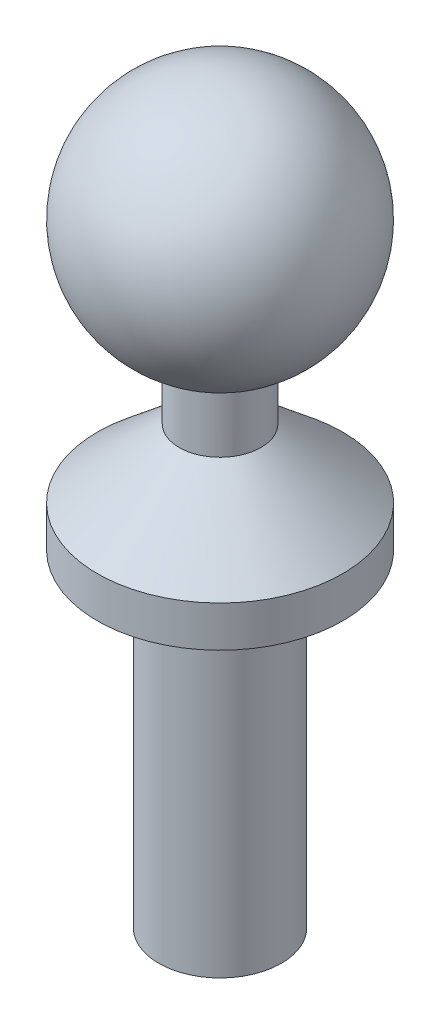
ISO-10303-21;
HEADER;
FILE_DESCRIPTION(('STEP AP214'),'2;1');
FILE_NAME('part.step','',(''),(''),'','','');
FILE_SCHEMA(('AUTOMOTIVE_DESIGN { 1 0 10303 214 1 1 1 1 }'));
ENDSEC;
DATA;
#1=APPLICATION_CONTEXT('core data for automotive mechanical design processes');
#2=APPLICATION_PROTOCOL_DEFINITION('international standard','automotive_design',2000,#1);
#3=PRODUCT_CONTEXT('',#1,'mechanical');
#4=PRODUCT('Part','Part','',(#3));
#5=PRODUCT_RELATED_PRODUCT_CATEGORY('part','',(#4));
#6=PRODUCT_DEFINITION_FORMATION('','',#4);
#7=PRODUCT_DEFINITION_CONTEXT('part definition',#1,'design');
#8=PRODUCT_DEFINITION('design','',#6,#7);
#9=PRODUCT_DEFINITION_SHAPE('','',#8);
#10=(LENGTH_UNIT() NAMED_UNIT(*) SI_UNIT(.MILLI.,.METRE.));
#11=(NAMED_UNIT(*) PLANE_ANGLE_UNIT() SI_UNIT($,.RADIAN.));
#12=(NAMED_UNIT(*) SI_UNIT($,.STERADIAN.) SOLID_ANGLE_UNIT());
#13=UNCERTAINTY_MEASURE_WITH_UNIT(LENGTH_MEASURE(1.E-05),#10,'distance_accuracy_value','');
#14=(GEOMETRIC_REPRESENTATION_CONTEXT(3) GLOBAL_UNCERTAINTY_ASSIGNED_CONTEXT((#13)) GLOBAL_UNIT_ASSIGNED_CONTEXT((#10,
#11,#12)) REPRESENTATION_CONTEXT('',''));
#15=CARTESIAN_POINT('',(0.,0.,0.));
#16=DIRECTION('',(0.,0.,1.));
#17=DIRECTION('',(1.,0.,0.));
#18=AXIS2_PLACEMENT_3D('',#15,#16,#17);
#19=CARTESIAN_POINT('',(0.,-15.,0.));
#20=DIRECTION('',(0.,-1.,0.));
#21=DIRECTION('',(0.,0.,-1.));
#22=AXIS2_PLACEMENT_3D('',#19,#20,#21);
#23=PLANE('',#22);
#24=CARTESIAN_POINT('',(0.,-15.,0.));
#25=DIRECTION('',(0.,-1.,0.));
#26=DIRECTION('',(0.,0.,-1.));
#27=AXIS2_PLACEMENT_3D('',#24,#25,#26);
#28=CIRCLE('',#27,1.5);
#29=CARTESIAN_POINT('',(0.,-15.,-1.5));
#30=VERTEX_POINT('',#29);
#31=EDGE_CURVE('E10',#30,#30,#28,.T.);
#32=ORIENTED_EDGE('',*,*,#31,.T.);
#33=EDGE_LOOP('',(#32));
#34=FACE_BOUND('',#33,.T.);
#35=ADVANCED_FACE('F38',(#34),#23,.T.);
#36=CARTESIAN_POINT('',(0.,-15.,0.));
#37=DIRECTION('',(0.,-1.,0.));
#38=DIRECTION('',(0.,0.,-1.));
#39=AXIS2_PLACEMENT_3D('',#36,#37,#38);
#40=CYLINDRICAL_SURFACE('',#39,1.5);
#41=CARTESIAN_POINT('',(0.,-7.,0.));
#42=DIRECTION('',(0.,-1.,0.));
#43=DIRECTION('',(0.,0.,-1.));
#44=AXIS2_PLACEMENT_3D('',#41,#42,#43);
#45=CIRCLE('',#44,1.5);
#46=CARTESIAN_POINT('',(0.,-7.,-1.5));
#47=VERTEX_POINT('',#46);
#48=EDGE_CURVE('E44',#47,#47,#45,.T.);
#49=ORIENTED_EDGE('',*,*,#48,.T.);
#50=EDGE_LOOP('',(#49));
#51=FACE_BOUND('',#50,.T.);
#52=ORIENTED_EDGE('',*,*,#31,.F.);
#53=EDGE_LOOP('',(#52));
#54=FACE_BOUND('',#53,.T.);
#55=ADVANCED_FACE('F76',(#51,#54),#40,.T.);
#56=CARTESIAN_POINT('',(1.5,-7.,0.));
#57=DIRECTION('',(0.,-1.,0.));
#58=DIRECTION('',(0.,0.,-1.));
#59=AXIS2_PLACEMENT_3D('',#56,#57,#58);
#60=PLANE('',#59);
#61=CARTESIAN_POINT('',(0.,-7.,0.));
#62=DIRECTION('',(0.,-1.,0.));
#63=DIRECTION('',(0.,0.,-1.));
#64=AXIS2_PLACEMENT_3D('',#61,#62,#63);
#65=CIRCLE('',#64,3.);
#66=CARTESIAN_POINT('',(0.,-7.,-3.));
#67=VERTEX_POINT('',#66);
#68=EDGE_CURVE('E48',#67,#67,#65,.T.);
#69=ORIENTED_EDGE('',*,*,#68,.T.);
#70=EDGE_LOOP('',(#69));
#71=FACE_BOUND('',#70,.T.);
#72=ORIENTED_EDGE('',*,*,#48,.F.);
#73=EDGE_LOOP('',(#72));
#74=FACE_BOUND('',#73,.T.);
#75=ADVANCED_FACE('F80',(#71,#74),#60,.T.);
#76=CARTESIAN_POINT('',(0.,-15.,0.));
#77=DIRECTION('',(0.,-1.,0.));
#78=DIRECTION('',(0.,0.,-1.));
#79=AXIS2_PLACEMENT_3D('',#76,#77,#78);
#80=CYLINDRICAL_SURFACE('',#79,3.);
#81=CARTESIAN_POINT('',(0.,-6.,0.));
#82=DIRECTION('',(0.,-1.,0.));
#83=DIRECTION('',(0.,0.,-1.));
#84=AXIS2_PLACEMENT_3D('',#81,#82,#83);
#85=CIRCLE('',#84,3.);
#86=CARTESIAN_POINT('',(0.,-6.,-3.));
#87=VERTEX_POINT('',#86);
#88=EDGE_CURVE('E52',#87,#87,#85,.T.);
#89=ORIENTED_EDGE('',*,*,#88,.T.);
#90=EDGE_LOOP('',(#89));
#91=FACE_BOUND('',#90,.T.);
#92=ORIENTED_EDGE('',*,*,#68,.F.);
#93=EDGE_LOOP('',(#92));
#94=FACE_BOUND('',#93,.T.);
#95=ADVANCED_FACE('F84',(#91,#94),#80,.T.);
#96=CARTESIAN_POINT('',(0.,-6.,0.));
#97=DIRECTION('',(0.,-1.,0.));
#98=DIRECTION('',(0.,0.,-1.));
#99=AXIS2_PLACEMENT_3D('',#96,#97,#98);
#100=CONICAL_SURFACE('',#99,3.,0.874612062430566);
#101=CARTESIAN_POINT('',(0.,-4.32842712474619,0.));
#102=DIRECTION('',(0.,-1.,0.));
#103=DIRECTION('',(0.,0.,-1.));
#104=AXIS2_PLACEMENT_3D('',#101,#102,#103);
#105=CIRCLE('',#104,0.999999999999998);
#106=CARTESIAN_POINT('',(0.,-4.32842712474619,-0.999999999999997));
#107=VERTEX_POINT('',#106);
#108=EDGE_CURVE('E57',#107,#107,#105,.T.);
#109=CARTESIAN_POINT('',(0.,-4.32842712474619,-0.999999999999997));
#110=CARTESIAN_POINT('',(0.,-4.34583934219675,-1.02083333333333));
#111=CARTESIAN_POINT('',(0.,-4.36325155964731,-1.04166666666666));
#112=CARTESIAN_POINT('',(0.,-4.39807599454843,-1.08333333333333));
#113=CARTESIAN_POINT('',(0.,-4.41548821199899,-1.10416666666666));
#114=CARTESIAN_POINT('',(0.,-4.45031264690011,-1.14583333333333));
#115=CARTESIAN_POINT('',(0.,-4.46772486435067,-1.16666666666666));
#116=CARTESIAN_POINT('',(0.,-4.5025492992518,-1.20833333333333));
#117=CARTESIAN_POINT('',(0.,-4.51996151670236,-1.22916666666666));
#118=CARTESIAN_POINT('',(0.,-4.55478595160348,-1.27083333333333));
#119=CARTESIAN_POINT('',(0.,-4.57219816905404,-1.29166666666666));
#120=CARTESIAN_POINT('',(0.,-4.60702260395516,-1.33333333333333));
#121=CARTESIAN_POINT('',(0.,-4.62443482140572,-1.35416666666666));
#122=CARTESIAN_POINT('',(0.,-4.65925925630684,-1.39583333333333));
#123=CARTESIAN_POINT('',(0.,-4.6766714737574,-1.41666666666666));
#124=CARTESIAN_POINT('',(0.,-4.71149590865852,-1.45833333333333));
#125=CARTESIAN_POINT('',(0.,-4.72890812610908,-1.47916666666666));
#126=CARTESIAN_POINT('',(0.,-4.7637325610102,-1.52083333333333));
#127=CARTESIAN_POINT('',(0.,-4.78114477846076,-1.54166666666666));
#128=CARTESIAN_POINT('',(0.,-4.81596921336189,-1.58333333333333));
#129=CARTESIAN_POINT('',(0.,-4.83338143081245,-1.60416666666666));
#130=CARTESIAN_POINT('',(0.,-4.86820586571357,-1.64583333333333));
#131=CARTESIAN_POINT('',(0.,-4.88561808316413,-1.66666666666666));
#132=CARTESIAN_POINT('',(0.,-4.92044251806525,-1.70833333333333));
#133=CARTESIAN_POINT('',(0.,-4.93785473551581,-1.72916666666666));
#134=CARTESIAN_POINT('',(0.,-4.97267917041693,-1.77083333333333));
#135=CARTESIAN_POINT('',(0.,-4.99009138786749,-1.79166666666666));
#136=CARTESIAN_POINT('',(0.,-5.02491582276861,-1.83333333333333));
#137=CARTESIAN_POINT('',(0.,-5.04232804021917,-1.85416666666666));
#138=CARTESIAN_POINT('',(0.,-5.07715247512029,-1.89583333333333));
#139=CARTESIAN_POINT('',(0.,-5.09456469257085,-1.91666666666666));
#140=CARTESIAN_POINT('',(0.,-5.12938912747197,-1.95833333333333));
#141=CARTESIAN_POINT('',(0.,-5.14680134492253,-1.97916666666667));
#142=CARTESIAN_POINT('',(0.,-5.18162577982366,-2.02083333333333));
#143=CARTESIAN_POINT('',(0.,-5.19903799727422,-2.04166666666667));
#144=CARTESIAN_POINT('',(0.,-5.23386243217534,-2.08333333333333));
#145=CARTESIAN_POINT('',(0.,-5.2512746496259,-2.10416666666666));
#146=CARTESIAN_POINT('',(0.,-5.28609908452702,-2.14583333333333));
#147=CARTESIAN_POINT('',(0.,-5.30351130197758,-2.16666666666667));
#148=CARTESIAN_POINT('',(0.,-5.3383357368787,-2.20833333333333));
#149=CARTESIAN_POINT('',(0.,-5.35574795432926,-2.22916666666667));
#150=CARTESIAN_POINT('',(0.,-5.39057238923038,-2.27083333333333));
#151=CARTESIAN_POINT('',(0.,-5.40798460668094,-2.29166666666667));
#152=CARTESIAN_POINT('',(0.,-5.44280904158206,-2.33333333333333));
#153=CARTESIAN_POINT('',(0.,-5.46022125903262,-2.35416666666667));
#154=CARTESIAN_POINT('',(0.,-5.49504569393375,-2.39583333333333));
#155=CARTESIAN_POINT('',(0.,-5.51245791138431,-2.41666666666667));
#156=CARTESIAN_POINT('',(0.,-5.54728234628543,-2.45833333333333));
#157=CARTESIAN_POINT('',(0.,-5.56469456373599,-2.47916666666667));
#158=CARTESIAN_POINT('',(0.,-5.59951899863711,-2.52083333333333));
#159=CARTESIAN_POINT('',(0.,-5.61693121608767,-2.54166666666667));
#160=CARTESIAN_POINT('',(0.,-5.65175565098879,-2.58333333333333));
#161=CARTESIAN_POINT('',(0.,-5.66916786843935,-2.60416666666667));
#162=CARTESIAN_POINT('',(0.,-5.70399230334047,-2.64583333333333));
#163=CARTESIAN_POINT('',(0.,-5.72140452079103,-2.66666666666667));
#164=CARTESIAN_POINT('',(0.,-5.75622895569215,-2.70833333333333));
#165=CARTESIAN_POINT('',(0.,-5.77364117314271,-2.72916666666667));
#166=CARTESIAN_POINT('',(0.,-5.80846560804384,-2.77083333333333));
#167=CARTESIAN_POINT('',(0.,-5.8258778254944,-2.79166666666667));
#168=CARTESIAN_POINT('',(0.,-5.86070226039552,-2.83333333333333));
#169=CARTESIAN_POINT('',(0.,-5.87811447784608,-2.85416666666667));
#170=CARTESIAN_POINT('',(0.,-5.9129389127472,-2.89583333333333));
#171=CARTESIAN_POINT('',(0.,-5.93035113019776,-2.91666666666667));
#172=CARTESIAN_POINT('',(0.,-5.96517556509888,-2.95833333333333));
#173=CARTESIAN_POINT('',(0.,-5.98258778254944,-2.97916666666667));
#174=CARTESIAN_POINT('',(0.,-6.,-3.));
#175=B_SPLINE_CURVE_WITH_KNOTS('',3,(#109,#110,#111,#112,#113,#114,#115,#116,#117,#118,#119,
#120,#121,#122,#123,#124,#125,#126,#127,#128,#129,#130,#131,#132,#133,#134,#135,#136,#137,#138,
#139,#140,#141,#142,#143,#144,#145,#146,#147,#148,#149,#150,#151,#152,#153,#154,#155,#156,#157,
#158,#159,#160,#161,#162,#163,#164,#165,#166,#167,#168,#169,#170,#171,#172,#173,#174),
.UNSPECIFIED.,.F.,.F.,(4,2,2,2,2,2,2,2,2,2,2,2,2,2,2,2,2,2,2,2,2,2,2,2,2,2,2,2,2,2,2,2,4),(0.,
0.0814550050574573,0.162910010114915,0.244365015172373,0.32582002022983,0.407275025287288,
0.488730030344746,0.570185035402203,0.651640040459661,0.733095045517119,0.814550050574576,
0.896005055632034,0.977460060689492,1.05891506574695,1.14037007080441,1.22182507586186,
1.30328008091932,1.38473508597678,1.46619009103424,1.5476450960917,1.62910010114915,
1.71055510620661,1.79201011126407,1.87346511632153,1.95492012137898,2.03637512643644,
2.1178301314939,2.19928513655136,2.28074014160881,2.36219514666627,2.44365015172373,
2.52510515678119,2.60656016183864),.UNSPECIFIED.);
#176=EDGE_CURVE('BSEAM73',#107,#87,#175,.T.);
#177=ORIENTED_EDGE('',*,*,#108,.T.);
#178=ORIENTED_EDGE('',*,*,#88,.F.);
#179=ORIENTED_EDGE('',*,*,#176,.T.);
#180=ORIENTED_EDGE('',*,*,#176,.F.);
#181=EDGE_LOOP('',(#177,#179,#178,#180));
#182=FACE_BOUND('',#181,.T.);
#183=ADVANCED_FACE('F73',(#182),#100,.T.);
#184=CARTESIAN_POINT('',(0.,-15.,0.));
#185=DIRECTION('',(0.,-1.,0.));
#186=DIRECTION('',(0.,0.,-1.));
#187=AXIS2_PLACEMENT_3D('',#184,#185,#186);
#188=CYLINDRICAL_SURFACE('',#187,0.999999999999998);
#189=CARTESIAN_POINT('',(0.,-2.82842712474619,0.));
#190=DIRECTION('',(0.,-1.,0.));
#191=DIRECTION('',(0.,0.,-1.));
#192=AXIS2_PLACEMENT_3D('',#189,#190,#191);
#193=CIRCLE('',#192,0.999999999999998);
#194=CARTESIAN_POINT('',(0.,-2.82842712474619,-0.999999999999998));
#195=VERTEX_POINT('',#194);
#196=EDGE_CURVE('E60',#195,#195,#193,.T.);
#197=ORIENTED_EDGE('',*,*,#196,.T.);
#198=EDGE_LOOP('',(#197));
#199=FACE_BOUND('',#198,.T.);
#200=ORIENTED_EDGE('',*,*,#108,.F.);
#201=EDGE_LOOP('',(#200));
#202=FACE_BOUND('',#201,.T.);
#203=ADVANCED_FACE('F64',(#199,#202),#188,.T.);
#204=CARTESIAN_POINT('',(0.,0.,0.));
#205=DIRECTION('',(0.,-1.,0.));
#206=DIRECTION('',(1.,0.,0.));
#207=AXIS2_PLACEMENT_3D('',#204,#205,#206);
#208=SPHERICAL_SURFACE('',#207,3.);
#209=ORIENTED_EDGE('',*,*,#196,.F.);
#210=EDGE_LOOP('',(#209));
#211=FACE_BOUND('',#210,.T.);
#212=ADVANCED_FACE('F67',(#211),#208,.T.);
#213=CLOSED_SHELL('',(#35,#55,#75,#95,#183,#203,#212));
#214=MANIFOLD_SOLID_BREP('B2',#213);
#215=ADVANCED_BREP_SHAPE_REPRESENTATION('',(#18,#214),#14);
#216=SHAPE_DEFINITION_REPRESENTATION(#9,#215);
ENDSEC;
END-ISO-10303-21;
